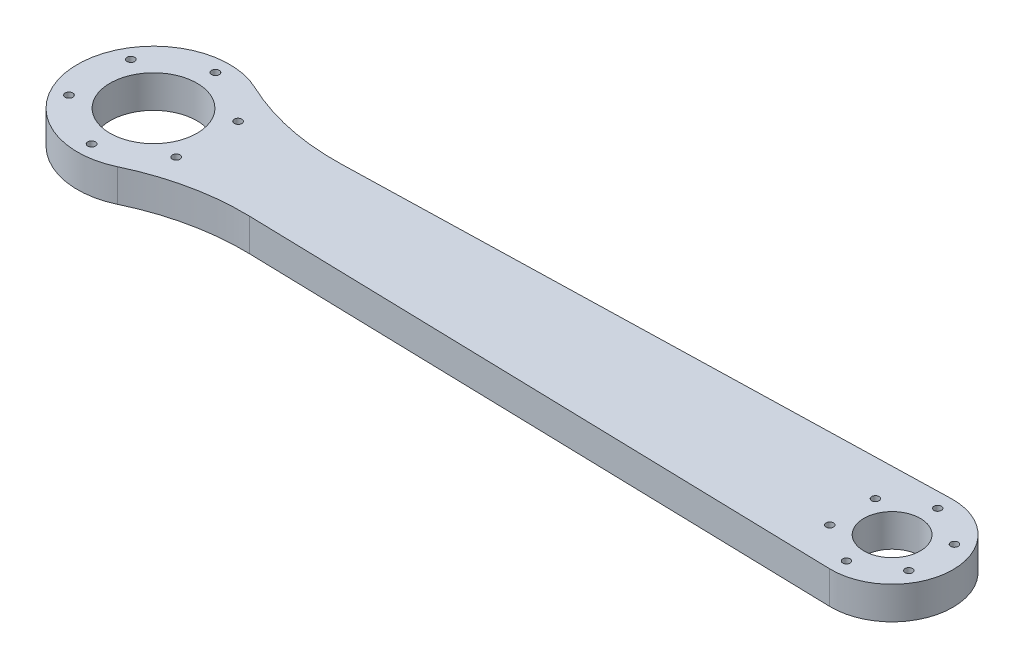
ISO-10303-21;
HEADER;
FILE_DESCRIPTION(('STEP AP214'),'2;1');
FILE_NAME('part.step','',(''),(''),'','','');
FILE_SCHEMA(('AUTOMOTIVE_DESIGN { 1 0 10303 214 1 1 1 1 }'));
ENDSEC;
DATA;
#1=APPLICATION_CONTEXT('core data for automotive mechanical design processes');
#2=APPLICATION_PROTOCOL_DEFINITION('international standard','automotive_design',2000,#1);
#3=PRODUCT_CONTEXT('',#1,'mechanical');
#4=PRODUCT('Part','Part','',(#3));
#5=PRODUCT_RELATED_PRODUCT_CATEGORY('part','',(#4));
#6=PRODUCT_DEFINITION_FORMATION('','',#4);
#7=PRODUCT_DEFINITION_CONTEXT('part definition',#1,'design');
#8=PRODUCT_DEFINITION('design','',#6,#7);
#9=PRODUCT_DEFINITION_SHAPE('','',#8);
#10=(LENGTH_UNIT() NAMED_UNIT(*) SI_UNIT(.MILLI.,.METRE.));
#11=(NAMED_UNIT(*) PLANE_ANGLE_UNIT() SI_UNIT($,.RADIAN.));
#12=(NAMED_UNIT(*) SI_UNIT($,.STERADIAN.) SOLID_ANGLE_UNIT());
#13=UNCERTAINTY_MEASURE_WITH_UNIT(LENGTH_MEASURE(1.E-05),#10,'distance_accuracy_value','');
#14=(GEOMETRIC_REPRESENTATION_CONTEXT(3) GLOBAL_UNCERTAINTY_ASSIGNED_CONTEXT((#13)) GLOBAL_UNIT_ASSIGNED_CONTEXT((#10,
#11,#12)) REPRESENTATION_CONTEXT('',''));
#15=CARTESIAN_POINT('',(0.,0.,0.));
#16=DIRECTION('',(0.,0.,1.));
#17=DIRECTION('',(1.,0.,0.));
#18=AXIS2_PLACEMENT_3D('',#15,#16,#17);
#19=CARTESIAN_POINT('',(340.,15.,0.));
#20=DIRECTION('',(0.,-1.,0.));
#21=DIRECTION('',(0.,0.,-1.));
#22=AXIS2_PLACEMENT_3D('',#19,#20,#21);
#23=PLANE('',#22);
#24=CARTESIAN_POINT('',(340.,15.,0.));
#25=DIRECTION('',(0.,1.,0.));
#26=DIRECTION('',(0.,0.,-1.));
#27=AXIS2_PLACEMENT_3D('',#24,#25,#26);
#28=CIRCLE('',#27,28.);
#29=CARTESIAN_POINT('',(339.279788909642,15.,27.9907358957446));
#30=VERTEX_POINT('',#29);
#31=CARTESIAN_POINT('',(339.279788909642,15.,-27.9907358957446));
#32=VERTEX_POINT('',#31);
#33=EDGE_CURVE('E131',#30,#32,#28,.T.);
#34=ORIENTED_EDGE('',*,*,#33,.T.);
#35=DIRECTION('',(-0.999669139133736,0.,0.0257218246556259));
#36=VECTOR('',#35,1.);
#37=CARTESIAN_POINT('',(65.1964156880508,15.,-20.9384781125971));
#38=LINE('',#37,#36);
#39=CARTESIAN_POINT('',(65.1964156880508,15.,-20.9384781125971));
#40=VERTEX_POINT('',#39);
#41=EDGE_CURVE('E89',#32,#40,#38,.T.);
#42=ORIENTED_EDGE('',*,*,#41,.T.);
#43=CARTESIAN_POINT('',(62.3670149759319,15.,-130.902083417308));
#44=DIRECTION('',(0.,-1.,0.));
#45=DIRECTION('',(0.,0.,1.));
#46=AXIS2_PLACEMENT_3D('',#43,#44,#45);
#47=CIRCLE('',#46,110.);
#48=CARTESIAN_POINT('',(15.0541070631559,15.,-31.5970546179709));
#49=VERTEX_POINT('',#48);
#50=EDGE_CURVE('E102',#40,#49,#47,.T.);
#51=ORIENTED_EDGE('',*,*,#50,.T.);
#52=CARTESIAN_POINT('',(0.,15.,2.42861286636753E-13));
#53=DIRECTION('',(0.,1.,0.));
#54=DIRECTION('',(0.,0.,1.));
#55=AXIS2_PLACEMENT_3D('',#52,#53,#54);
#56=CIRCLE('',#55,35.);
#57=CARTESIAN_POINT('',(15.0541070631561,15.,31.5970546179711));
#58=VERTEX_POINT('',#57);
#59=EDGE_CURVE('E96',#49,#58,#56,.T.);
#60=ORIENTED_EDGE('',*,*,#59,.T.);
#61=CARTESIAN_POINT('',(62.3670149759319,15.,130.902083417308));
#62=DIRECTION('',(0.,-1.,0.));
#63=DIRECTION('',(0.,0.,-1.));
#64=AXIS2_PLACEMENT_3D('',#61,#62,#63);
#65=CIRCLE('',#64,110.);
#66=CARTESIAN_POINT('',(65.1964156880508,15.,20.9384781125971));
#67=VERTEX_POINT('',#66);
#68=EDGE_CURVE('E100',#58,#67,#65,.T.);
#69=ORIENTED_EDGE('',*,*,#68,.T.);
#70=DIRECTION('',(0.999669139133736,0.,0.0257218246556259));
#71=VECTOR('',#70,1.);
#72=CARTESIAN_POINT('',(65.1964156880508,15.,20.9384781125971));
#73=LINE('',#72,#71);
#74=EDGE_CURVE('E52',#67,#30,#73,.T.);
#75=ORIENTED_EDGE('',*,*,#74,.T.);
#76=EDGE_LOOP('',(#34,#42,#51,#60,#69,#75));
#77=FACE_BOUND('',#76,.T.);
#78=CARTESIAN_POINT('',(0.,15.,0.));
#79=DIRECTION('',(0.,1.,0.));
#80=DIRECTION('',(0.,0.,1.));
#81=AXIS2_PLACEMENT_3D('',#78,#79,#80);
#82=CIRCLE('',#81,20.);
#83=CARTESIAN_POINT('',(0.,15.,20.));
#84=VERTEX_POINT('',#83);
#85=EDGE_CURVE('E124',#84,#84,#82,.T.);
#86=ORIENTED_EDGE('',*,*,#85,.F.);
#87=EDGE_LOOP('',(#86));
#88=FACE_BOUND('',#87,.T.);
#89=CARTESIAN_POINT('',(340.,15.,0.));
#90=DIRECTION('',(0.,1.,0.));
#91=DIRECTION('',(0.,0.,1.));
#92=AXIS2_PLACEMENT_3D('',#89,#90,#91);
#93=CIRCLE('',#92,13.);
#94=CARTESIAN_POINT('',(340.,15.,13.));
#95=VERTEX_POINT('',#94);
#96=EDGE_CURVE('E295',#95,#95,#93,.T.);
#97=ORIENTED_EDGE('',*,*,#96,.F.);
#98=EDGE_LOOP('',(#97));
#99=FACE_BOUND('',#98,.T.);
#100=CARTESIAN_POINT('',(358.186533479473,15.,-10.5));
#101=DIRECTION('',(0.,1.,0.));
#102=DIRECTION('',(0.,0.,1.));
#103=AXIS2_PLACEMENT_3D('',#100,#101,#102);
#104=CIRCLE('',#103,1.69999999999996);
#105=CARTESIAN_POINT('',(358.186533479473,15.,-8.80000000000005));
#106=VERTEX_POINT('',#105);
#107=EDGE_CURVE('E289',#106,#106,#104,.T.);
#108=ORIENTED_EDGE('',*,*,#107,.F.);
#109=EDGE_LOOP('',(#108));
#110=FACE_BOUND('',#109,.T.);
#111=CARTESIAN_POINT('',(340.,15.,-21.));
#112=DIRECTION('',(0.,1.,0.));
#113=DIRECTION('',(0.,0.,1.));
#114=AXIS2_PLACEMENT_3D('',#111,#112,#113);
#115=CIRCLE('',#114,1.69999999999996);
#116=CARTESIAN_POINT('',(340.,15.,-19.3));
#117=VERTEX_POINT('',#116);
#118=EDGE_CURVE('E283',#117,#117,#115,.T.);
#119=ORIENTED_EDGE('',*,*,#118,.F.);
#120=EDGE_LOOP('',(#119));
#121=FACE_BOUND('',#120,.T.);
#122=CARTESIAN_POINT('',(358.186533479473,15.,10.5));
#123=DIRECTION('',(0.,1.,0.));
#124=DIRECTION('',(0.,0.,1.));
#125=AXIS2_PLACEMENT_3D('',#122,#123,#124);
#126=CIRCLE('',#125,1.69999999999996);
#127=CARTESIAN_POINT('',(358.186533479473,15.,12.1999999999999));
#128=VERTEX_POINT('',#127);
#129=EDGE_CURVE('E277',#128,#128,#126,.T.);
#130=ORIENTED_EDGE('',*,*,#129,.F.);
#131=EDGE_LOOP('',(#130));
#132=FACE_BOUND('',#131,.T.);
#133=CARTESIAN_POINT('',(340.,15.,21.));
#134=DIRECTION('',(0.,1.,0.));
#135=DIRECTION('',(0.,0.,1.));
#136=AXIS2_PLACEMENT_3D('',#133,#134,#135);
#137=CIRCLE('',#136,1.69999999999996);
#138=CARTESIAN_POINT('',(340.,15.,22.6999999999999));
#139=VERTEX_POINT('',#138);
#140=EDGE_CURVE('E271',#139,#139,#137,.T.);
#141=ORIENTED_EDGE('',*,*,#140,.F.);
#142=EDGE_LOOP('',(#141));
#143=FACE_BOUND('',#142,.T.);
#144=CARTESIAN_POINT('',(321.813466520527,15.,10.5));
#145=DIRECTION('',(0.,1.,0.));
#146=DIRECTION('',(0.,0.,1.));
#147=AXIS2_PLACEMENT_3D('',#144,#145,#146);
#148=CIRCLE('',#147,1.69999999999996);
#149=CARTESIAN_POINT('',(321.813466520527,15.,12.2));
#150=VERTEX_POINT('',#149);
#151=EDGE_CURVE('E265',#150,#150,#148,.T.);
#152=ORIENTED_EDGE('',*,*,#151,.F.);
#153=EDGE_LOOP('',(#152));
#154=FACE_BOUND('',#153,.T.);
#155=CARTESIAN_POINT('',(321.813466520527,15.,-10.5));
#156=DIRECTION('',(0.,1.,0.));
#157=DIRECTION('',(0.,0.,1.));
#158=AXIS2_PLACEMENT_3D('',#155,#156,#157);
#159=CIRCLE('',#158,1.69999999999996);
#160=CARTESIAN_POINT('',(321.813466520527,15.,-8.80000000000005));
#161=VERTEX_POINT('',#160);
#162=EDGE_CURVE('E259',#161,#161,#159,.T.);
#163=ORIENTED_EDGE('',*,*,#162,.F.);
#164=EDGE_LOOP('',(#163));
#165=FACE_BOUND('',#164,.T.);
#166=CARTESIAN_POINT('',(-24.6817240078565,15.,-14.25));
#167=DIRECTION('',(0.,1.,0.));
#168=DIRECTION('',(0.,0.,1.));
#169=AXIS2_PLACEMENT_3D('',#166,#167,#168);
#170=CIRCLE('',#169,1.75);
#171=CARTESIAN_POINT('',(-24.6817240078565,15.,-12.5));
#172=VERTEX_POINT('',#171);
#173=EDGE_CURVE('E253',#172,#172,#170,.T.);
#174=ORIENTED_EDGE('',*,*,#173,.F.);
#175=EDGE_LOOP('',(#174));
#176=FACE_BOUND('',#175,.T.);
#177=CARTESIAN_POINT('',(0.,15.,-28.5));
#178=DIRECTION('',(0.,1.,0.));
#179=DIRECTION('',(0.,0.,1.));
#180=AXIS2_PLACEMENT_3D('',#177,#178,#179);
#181=CIRCLE('',#180,1.75);
#182=CARTESIAN_POINT('',(0.,15.,-26.75));
#183=VERTEX_POINT('',#182);
#184=EDGE_CURVE('E247',#183,#183,#181,.T.);
#185=ORIENTED_EDGE('',*,*,#184,.F.);
#186=EDGE_LOOP('',(#185));
#187=FACE_BOUND('',#186,.T.);
#188=CARTESIAN_POINT('',(-24.6817240078565,15.,14.25));
#189=DIRECTION('',(0.,1.,0.));
#190=DIRECTION('',(0.,0.,1.));
#191=AXIS2_PLACEMENT_3D('',#188,#189,#190);
#192=CIRCLE('',#191,1.75);
#193=CARTESIAN_POINT('',(-24.6817240078565,15.,16.));
#194=VERTEX_POINT('',#193);
#195=EDGE_CURVE('E241',#194,#194,#192,.T.);
#196=ORIENTED_EDGE('',*,*,#195,.F.);
#197=EDGE_LOOP('',(#196));
#198=FACE_BOUND('',#197,.T.);
#199=CARTESIAN_POINT('',(0.,15.,28.5));
#200=DIRECTION('',(0.,1.,0.));
#201=DIRECTION('',(0.,0.,1.));
#202=AXIS2_PLACEMENT_3D('',#199,#200,#201);
#203=CIRCLE('',#202,1.75);
#204=CARTESIAN_POINT('',(0.,15.,30.25));
#205=VERTEX_POINT('',#204);
#206=EDGE_CURVE('E235',#205,#205,#203,.T.);
#207=ORIENTED_EDGE('',*,*,#206,.F.);
#208=EDGE_LOOP('',(#207));
#209=FACE_BOUND('',#208,.T.);
#210=CARTESIAN_POINT('',(24.6817240078565,15.,14.25));
#211=DIRECTION('',(0.,1.,0.));
#212=DIRECTION('',(0.,0.,1.));
#213=AXIS2_PLACEMENT_3D('',#210,#211,#212);
#214=CIRCLE('',#213,1.75);
#215=CARTESIAN_POINT('',(24.6817240078565,15.,16.));
#216=VERTEX_POINT('',#215);
#217=EDGE_CURVE('E229',#216,#216,#214,.T.);
#218=ORIENTED_EDGE('',*,*,#217,.F.);
#219=EDGE_LOOP('',(#218));
#220=FACE_BOUND('',#219,.T.);
#221=CARTESIAN_POINT('',(24.6817240078565,15.,-14.25));
#222=DIRECTION('',(0.,1.,0.));
#223=DIRECTION('',(0.,0.,1.));
#224=AXIS2_PLACEMENT_3D('',#221,#222,#223);
#225=CIRCLE('',#224,1.75);
#226=CARTESIAN_POINT('',(24.6817240078565,15.,-12.5));
#227=VERTEX_POINT('',#226);
#228=EDGE_CURVE('E220',#227,#227,#225,.T.);
#229=ORIENTED_EDGE('',*,*,#228,.F.);
#230=EDGE_LOOP('',(#229));
#231=FACE_BOUND('',#230,.T.);
#232=ADVANCED_FACE('F35',(#77,#88,#99,#110,#121,#132,#143,#154,#165,#176,#187,#198,#209,#220,
#231),#23,.F.);
#233=CARTESIAN_POINT('',(340.,0.,0.));
#234=DIRECTION('',(0.,-1.,0.));
#235=DIRECTION('',(0.,0.,-1.));
#236=AXIS2_PLACEMENT_3D('',#233,#234,#235);
#237=PLANE('',#236);
#238=CARTESIAN_POINT('',(24.6817240078565,0.,14.25));
#239=DIRECTION('',(0.,1.,0.));
#240=DIRECTION('',(0.,0.,1.));
#241=AXIS2_PLACEMENT_3D('',#238,#239,#240);
#242=CIRCLE('',#241,1.75);
#243=CARTESIAN_POINT('',(24.6817240078565,0.,16.));
#244=VERTEX_POINT('',#243);
#245=EDGE_CURVE('E226',#244,#244,#242,.T.);
#246=ORIENTED_EDGE('',*,*,#245,.T.);
#247=EDGE_LOOP('',(#246));
#248=FACE_BOUND('',#247,.T.);
#249=CARTESIAN_POINT('',(-24.6817240078565,0.,14.25));
#250=DIRECTION('',(0.,1.,0.));
#251=DIRECTION('',(0.,0.,1.));
#252=AXIS2_PLACEMENT_3D('',#249,#250,#251);
#253=CIRCLE('',#252,1.75);
#254=CARTESIAN_POINT('',(-24.6817240078565,0.,16.));
#255=VERTEX_POINT('',#254);
#256=EDGE_CURVE('E238',#255,#255,#253,.T.);
#257=ORIENTED_EDGE('',*,*,#256,.T.);
#258=EDGE_LOOP('',(#257));
#259=FACE_BOUND('',#258,.T.);
#260=CARTESIAN_POINT('',(-24.6817240078565,0.,-14.25));
#261=DIRECTION('',(0.,1.,0.));
#262=DIRECTION('',(0.,0.,1.));
#263=AXIS2_PLACEMENT_3D('',#260,#261,#262);
#264=CIRCLE('',#263,1.75);
#265=CARTESIAN_POINT('',(-24.6817240078565,0.,-12.5));
#266=VERTEX_POINT('',#265);
#267=EDGE_CURVE('E250',#266,#266,#264,.T.);
#268=ORIENTED_EDGE('',*,*,#267,.T.);
#269=EDGE_LOOP('',(#268));
#270=FACE_BOUND('',#269,.T.);
#271=CARTESIAN_POINT('',(321.813466520527,0.,10.5));
#272=DIRECTION('',(0.,1.,0.));
#273=DIRECTION('',(0.,0.,1.));
#274=AXIS2_PLACEMENT_3D('',#271,#272,#273);
#275=CIRCLE('',#274,1.69999999999996);
#276=CARTESIAN_POINT('',(321.813466520527,0.,12.2));
#277=VERTEX_POINT('',#276);
#278=EDGE_CURVE('E262',#277,#277,#275,.T.);
#279=ORIENTED_EDGE('',*,*,#278,.T.);
#280=EDGE_LOOP('',(#279));
#281=FACE_BOUND('',#280,.T.);
#282=CARTESIAN_POINT('',(358.186533479473,0.,10.5));
#283=DIRECTION('',(0.,1.,0.));
#284=DIRECTION('',(0.,0.,1.));
#285=AXIS2_PLACEMENT_3D('',#282,#283,#284);
#286=CIRCLE('',#285,1.69999999999996);
#287=CARTESIAN_POINT('',(358.186533479473,0.,12.1999999999999));
#288=VERTEX_POINT('',#287);
#289=EDGE_CURVE('E274',#288,#288,#286,.T.);
#290=ORIENTED_EDGE('',*,*,#289,.T.);
#291=EDGE_LOOP('',(#290));
#292=FACE_BOUND('',#291,.T.);
#293=CARTESIAN_POINT('',(358.186533479473,0.,-10.5));
#294=DIRECTION('',(0.,1.,0.));
#295=DIRECTION('',(0.,0.,1.));
#296=AXIS2_PLACEMENT_3D('',#293,#294,#295);
#297=CIRCLE('',#296,1.69999999999996);
#298=CARTESIAN_POINT('',(358.186533479473,0.,-8.80000000000005));
#299=VERTEX_POINT('',#298);
#300=EDGE_CURVE('E286',#299,#299,#297,.T.);
#301=ORIENTED_EDGE('',*,*,#300,.T.);
#302=EDGE_LOOP('',(#301));
#303=FACE_BOUND('',#302,.T.);
#304=CARTESIAN_POINT('',(0.,0.,0.));
#305=DIRECTION('',(0.,1.,0.));
#306=DIRECTION('',(0.,0.,1.));
#307=AXIS2_PLACEMENT_3D('',#304,#305,#306);
#308=CIRCLE('',#307,20.);
#309=CARTESIAN_POINT('',(0.,0.,20.));
#310=VERTEX_POINT('',#309);
#311=EDGE_CURVE('E298',#310,#310,#308,.T.);
#312=ORIENTED_EDGE('',*,*,#311,.T.);
#313=EDGE_LOOP('',(#312));
#314=FACE_BOUND('',#313,.T.);
#315=CARTESIAN_POINT('',(340.,0.,0.));
#316=DIRECTION('',(0.,1.,0.));
#317=DIRECTION('',(0.,0.,-1.));
#318=AXIS2_PLACEMENT_3D('',#315,#316,#317);
#319=CIRCLE('',#318,28.);
#320=CARTESIAN_POINT('',(339.279788909642,0.,27.9907358957446));
#321=VERTEX_POINT('',#320);
#322=CARTESIAN_POINT('',(339.279788909642,0.,-27.9907358957446));
#323=VERTEX_POINT('',#322);
#324=EDGE_CURVE('E120',#321,#323,#319,.T.);
#325=ORIENTED_EDGE('',*,*,#324,.F.);
#326=DIRECTION('',(0.999669139133736,0.,0.0257218246556259));
#327=VECTOR('',#326,1.);
#328=CARTESIAN_POINT('',(65.1964156880508,0.,20.9384781125971));
#329=LINE('',#328,#327);
#330=CARTESIAN_POINT('',(65.1964156880508,0.,20.9384781125971));
#331=VERTEX_POINT('',#330);
#332=EDGE_CURVE('E81',#331,#321,#329,.T.);
#333=ORIENTED_EDGE('',*,*,#332,.F.);
#334=CARTESIAN_POINT('',(62.3670149759319,0.,130.902083417308));
#335=DIRECTION('',(0.,-1.,0.));
#336=DIRECTION('',(0.,0.,-1.));
#337=AXIS2_PLACEMENT_3D('',#334,#335,#336);
#338=CIRCLE('',#337,110.);
#339=CARTESIAN_POINT('',(15.0541070631561,0.,31.5970546179711));
#340=VERTEX_POINT('',#339);
#341=EDGE_CURVE('E75',#340,#331,#338,.T.);
#342=ORIENTED_EDGE('',*,*,#341,.F.);
#343=CARTESIAN_POINT('',(0.,0.,2.42861286636753E-13));
#344=DIRECTION('',(0.,1.,0.));
#345=DIRECTION('',(0.,0.,1.));
#346=AXIS2_PLACEMENT_3D('',#343,#344,#345);
#347=CIRCLE('',#346,35.);
#348=CARTESIAN_POINT('',(15.0541070631559,0.,-31.5970546179709));
#349=VERTEX_POINT('',#348);
#350=EDGE_CURVE('E110',#349,#340,#347,.T.);
#351=ORIENTED_EDGE('',*,*,#350,.F.);
#352=CARTESIAN_POINT('',(62.3670149759319,0.,-130.902083417308));
#353=DIRECTION('',(0.,-1.,0.));
#354=DIRECTION('',(0.,0.,1.));
#355=AXIS2_PLACEMENT_3D('',#352,#353,#354);
#356=CIRCLE('',#355,110.);
#357=CARTESIAN_POINT('',(65.1964156880508,0.,-20.9384781125971));
#358=VERTEX_POINT('',#357);
#359=EDGE_CURVE('E126',#358,#349,#356,.T.);
#360=ORIENTED_EDGE('',*,*,#359,.F.);
#361=DIRECTION('',(-0.999669139133736,0.,0.0257218246556259));
#362=VECTOR('',#361,1.);
#363=CARTESIAN_POINT('',(65.1964156880508,0.,-20.9384781125971));
#364=LINE('',#363,#362);
#365=EDGE_CURVE('E123',#323,#358,#364,.T.);
#366=ORIENTED_EDGE('',*,*,#365,.F.);
#367=EDGE_LOOP('',(#325,#333,#342,#351,#360,#366));
#368=FACE_BOUND('',#367,.T.);
#369=CARTESIAN_POINT('',(340.,0.,0.));
#370=DIRECTION('',(0.,1.,0.));
#371=DIRECTION('',(0.,0.,1.));
#372=AXIS2_PLACEMENT_3D('',#369,#370,#371);
#373=CIRCLE('',#372,13.);
#374=CARTESIAN_POINT('',(340.,0.,13.));
#375=VERTEX_POINT('',#374);
#376=EDGE_CURVE('E292',#375,#375,#373,.T.);
#377=ORIENTED_EDGE('',*,*,#376,.T.);
#378=EDGE_LOOP('',(#377));
#379=FACE_BOUND('',#378,.T.);
#380=CARTESIAN_POINT('',(340.,0.,-21.));
#381=DIRECTION('',(0.,1.,0.));
#382=DIRECTION('',(0.,0.,1.));
#383=AXIS2_PLACEMENT_3D('',#380,#381,#382);
#384=CIRCLE('',#383,1.69999999999996);
#385=CARTESIAN_POINT('',(340.,0.,-19.3));
#386=VERTEX_POINT('',#385);
#387=EDGE_CURVE('E280',#386,#386,#384,.T.);
#388=ORIENTED_EDGE('',*,*,#387,.T.);
#389=EDGE_LOOP('',(#388));
#390=FACE_BOUND('',#389,.T.);
#391=CARTESIAN_POINT('',(340.,0.,21.));
#392=DIRECTION('',(0.,1.,0.));
#393=DIRECTION('',(0.,0.,1.));
#394=AXIS2_PLACEMENT_3D('',#391,#392,#393);
#395=CIRCLE('',#394,1.69999999999996);
#396=CARTESIAN_POINT('',(340.,0.,22.6999999999999));
#397=VERTEX_POINT('',#396);
#398=EDGE_CURVE('E268',#397,#397,#395,.T.);
#399=ORIENTED_EDGE('',*,*,#398,.T.);
#400=EDGE_LOOP('',(#399));
#401=FACE_BOUND('',#400,.T.);
#402=CARTESIAN_POINT('',(321.813466520527,0.,-10.5));
#403=DIRECTION('',(0.,1.,0.));
#404=DIRECTION('',(0.,0.,1.));
#405=AXIS2_PLACEMENT_3D('',#402,#403,#404);
#406=CIRCLE('',#405,1.69999999999996);
#407=CARTESIAN_POINT('',(321.813466520527,0.,-8.80000000000005));
#408=VERTEX_POINT('',#407);
#409=EDGE_CURVE('E256',#408,#408,#406,.T.);
#410=ORIENTED_EDGE('',*,*,#409,.T.);
#411=EDGE_LOOP('',(#410));
#412=FACE_BOUND('',#411,.T.);
#413=CARTESIAN_POINT('',(0.,0.,-28.5));
#414=DIRECTION('',(0.,1.,0.));
#415=DIRECTION('',(0.,0.,1.));
#416=AXIS2_PLACEMENT_3D('',#413,#414,#415);
#417=CIRCLE('',#416,1.75);
#418=CARTESIAN_POINT('',(0.,0.,-26.75));
#419=VERTEX_POINT('',#418);
#420=EDGE_CURVE('E244',#419,#419,#417,.T.);
#421=ORIENTED_EDGE('',*,*,#420,.T.);
#422=EDGE_LOOP('',(#421));
#423=FACE_BOUND('',#422,.T.);
#424=CARTESIAN_POINT('',(0.,0.,28.5));
#425=DIRECTION('',(0.,1.,0.));
#426=DIRECTION('',(0.,0.,1.));
#427=AXIS2_PLACEMENT_3D('',#424,#425,#426);
#428=CIRCLE('',#427,1.75);
#429=CARTESIAN_POINT('',(0.,0.,30.25));
#430=VERTEX_POINT('',#429);
#431=EDGE_CURVE('E232',#430,#430,#428,.T.);
#432=ORIENTED_EDGE('',*,*,#431,.T.);
#433=EDGE_LOOP('',(#432));
#434=FACE_BOUND('',#433,.T.);
#435=CARTESIAN_POINT('',(24.6817240078565,0.,-14.25));
#436=DIRECTION('',(0.,1.,0.));
#437=DIRECTION('',(0.,0.,1.));
#438=AXIS2_PLACEMENT_3D('',#435,#436,#437);
#439=CIRCLE('',#438,1.75);
#440=CARTESIAN_POINT('',(24.6817240078565,0.,-12.5));
#441=VERTEX_POINT('',#440);
#442=EDGE_CURVE('E223',#441,#441,#439,.T.);
#443=ORIENTED_EDGE('',*,*,#442,.T.);
#444=EDGE_LOOP('',(#443));
#445=FACE_BOUND('',#444,.T.);
#446=ADVANCED_FACE('F140',(#248,#259,#270,#281,#292,#303,#314,#368,#379,#390,#401,#412,#423,
#434,#445),#237,.T.);
#447=CARTESIAN_POINT('',(340.,15.,0.));
#448=DIRECTION('',(0.,-1.,0.));
#449=DIRECTION('',(0.,0.,-1.));
#450=AXIS2_PLACEMENT_3D('',#447,#448,#449);
#451=CYLINDRICAL_SURFACE('',#450,28.);
#452=ORIENTED_EDGE('',*,*,#324,.T.);
#453=DIRECTION('',(0.,-1.,0.));
#454=VECTOR('',#453,1.);
#455=CARTESIAN_POINT('',(339.279788909642,15.,-27.9907358957446));
#456=LINE('',#455,#454);
#457=EDGE_CURVE('E11',#32,#323,#456,.T.);
#458=ORIENTED_EDGE('',*,*,#457,.F.);
#459=ORIENTED_EDGE('',*,*,#33,.F.);
#460=DIRECTION('',(0.,-1.,0.));
#461=VECTOR('',#460,1.);
#462=CARTESIAN_POINT('',(339.279788909642,15.,27.9907358957446));
#463=LINE('',#462,#461);
#464=EDGE_CURVE('E116',#30,#321,#463,.T.);
#465=ORIENTED_EDGE('',*,*,#464,.T.);
#466=EDGE_LOOP('',(#452,#458,#459,#465));
#467=FACE_BOUND('',#466,.T.);
#468=ADVANCED_FACE('F37',(#467),#451,.T.);
#469=CARTESIAN_POINT('',(65.1964156880508,15.,-20.9384781125971));
#470=DIRECTION('',(0.0257218246556259,0.,0.999669139133736));
#471=DIRECTION('',(0.999669139133736,0.,-0.0257218246556259));
#472=AXIS2_PLACEMENT_3D('',#469,#470,#471);
#473=PLANE('',#472);
#474=ORIENTED_EDGE('',*,*,#365,.T.);
#475=DIRECTION('',(0.,-1.,0.));
#476=VECTOR('',#475,1.);
#477=CARTESIAN_POINT('',(65.1964156880508,15.,-20.9384781125971));
#478=LINE('',#477,#476);
#479=EDGE_CURVE('E44',#40,#358,#478,.T.);
#480=ORIENTED_EDGE('',*,*,#479,.F.);
#481=ORIENTED_EDGE('',*,*,#41,.F.);
#482=ORIENTED_EDGE('',*,*,#457,.T.);
#483=EDGE_LOOP('',(#474,#480,#481,#482));
#484=FACE_BOUND('',#483,.T.);
#485=ADVANCED_FACE('F448',(#484),#473,.F.);
#486=CARTESIAN_POINT('',(62.3670149759319,15.,-130.902083417308));
#487=DIRECTION('',(0.,-1.,0.));
#488=DIRECTION('',(0.,0.,-1.));
#489=AXIS2_PLACEMENT_3D('',#486,#487,#488);
#490=CYLINDRICAL_SURFACE('',#489,110.);
#491=ORIENTED_EDGE('',*,*,#359,.T.);
#492=DIRECTION('',(0.,-1.,0.));
#493=VECTOR('',#492,1.);
#494=CARTESIAN_POINT('',(15.0541070631559,15.,-31.5970546179709));
#495=LINE('',#494,#493);
#496=EDGE_CURVE('E111',#49,#349,#495,.T.);
#497=ORIENTED_EDGE('',*,*,#496,.F.);
#498=ORIENTED_EDGE('',*,*,#50,.F.);
#499=ORIENTED_EDGE('',*,*,#479,.T.);
#500=EDGE_LOOP('',(#491,#497,#498,#499));
#501=FACE_BOUND('',#500,.T.);
#502=ADVANCED_FACE('F137',(#501),#490,.F.);
#503=CARTESIAN_POINT('',(0.,15.,2.42861286636753E-13));
#504=DIRECTION('',(0.,-1.,0.));
#505=DIRECTION('',(0.,0.,-1.));
#506=AXIS2_PLACEMENT_3D('',#503,#504,#505);
#507=CYLINDRICAL_SURFACE('',#506,35.);
#508=ORIENTED_EDGE('',*,*,#350,.T.);
#509=DIRECTION('',(0.,-1.,0.));
#510=VECTOR('',#509,1.);
#511=CARTESIAN_POINT('',(15.0541070631561,15.,31.5970546179711));
#512=LINE('',#511,#510);
#513=EDGE_CURVE('E107',#58,#340,#512,.T.);
#514=ORIENTED_EDGE('',*,*,#513,.F.);
#515=ORIENTED_EDGE('',*,*,#59,.F.);
#516=ORIENTED_EDGE('',*,*,#496,.T.);
#517=EDGE_LOOP('',(#508,#514,#515,#516));
#518=FACE_BOUND('',#517,.T.);
#519=ADVANCED_FACE('F108',(#518),#507,.T.);
#520=CARTESIAN_POINT('',(62.3670149759319,15.,130.902083417308));
#521=DIRECTION('',(0.,-1.,0.));
#522=DIRECTION('',(0.,0.,-1.));
#523=AXIS2_PLACEMENT_3D('',#520,#521,#522);
#524=CYLINDRICAL_SURFACE('',#523,110.);
#525=ORIENTED_EDGE('',*,*,#341,.T.);
#526=DIRECTION('',(0.,-1.,0.));
#527=VECTOR('',#526,1.);
#528=CARTESIAN_POINT('',(65.1964156880508,15.,20.9384781125971));
#529=LINE('',#528,#527);
#530=EDGE_CURVE('E112',#67,#331,#529,.T.);
#531=ORIENTED_EDGE('',*,*,#530,.F.);
#532=ORIENTED_EDGE('',*,*,#68,.F.);
#533=ORIENTED_EDGE('',*,*,#513,.T.);
#534=EDGE_LOOP('',(#525,#531,#532,#533));
#535=FACE_BOUND('',#534,.T.);
#536=ADVANCED_FACE('F114',(#535),#524,.F.);
#537=CARTESIAN_POINT('',(65.1964156880508,15.,20.9384781125971));
#538=DIRECTION('',(0.0257218246556259,0.,-0.999669139133736));
#539=DIRECTION('',(-0.999669139133736,0.,-0.0257218246556259));
#540=AXIS2_PLACEMENT_3D('',#537,#538,#539);
#541=PLANE('',#540);
#542=ORIENTED_EDGE('',*,*,#332,.T.);
#543=ORIENTED_EDGE('',*,*,#464,.F.);
#544=ORIENTED_EDGE('',*,*,#74,.F.);
#545=ORIENTED_EDGE('',*,*,#530,.T.);
#546=EDGE_LOOP('',(#542,#543,#544,#545));
#547=FACE_BOUND('',#546,.T.);
#548=ADVANCED_FACE('F145',(#547),#541,.F.);
#549=CARTESIAN_POINT('',(0.,15.,0.));
#550=DIRECTION('',(0.,-1.,0.));
#551=DIRECTION('',(0.,0.,-1.));
#552=AXIS2_PLACEMENT_3D('',#549,#550,#551);
#553=CYLINDRICAL_SURFACE('',#552,20.);
#554=ORIENTED_EDGE('',*,*,#85,.T.);
#555=EDGE_LOOP('',(#554));
#556=FACE_BOUND('',#555,.T.);
#557=ORIENTED_EDGE('',*,*,#311,.F.);
#558=EDGE_LOOP('',(#557));
#559=FACE_BOUND('',#558,.T.);
#560=ADVANCED_FACE('F147',(#556,#559),#553,.F.);
#561=CARTESIAN_POINT('',(340.,15.,0.));
#562=DIRECTION('',(0.,-1.,0.));
#563=DIRECTION('',(0.,0.,-1.));
#564=AXIS2_PLACEMENT_3D('',#561,#562,#563);
#565=CYLINDRICAL_SURFACE('',#564,13.);
#566=ORIENTED_EDGE('',*,*,#96,.T.);
#567=EDGE_LOOP('',(#566));
#568=FACE_BOUND('',#567,.T.);
#569=ORIENTED_EDGE('',*,*,#376,.F.);
#570=EDGE_LOOP('',(#569));
#571=FACE_BOUND('',#570,.T.);
#572=ADVANCED_FACE('F153',(#568,#571),#565,.F.);
#573=CARTESIAN_POINT('',(358.186533479473,15.,-10.5));
#574=DIRECTION('',(0.,-1.,0.));
#575=DIRECTION('',(0.,0.,-1.));
#576=AXIS2_PLACEMENT_3D('',#573,#574,#575);
#577=CYLINDRICAL_SURFACE('',#576,1.69999999999996);
#578=ORIENTED_EDGE('',*,*,#107,.T.);
#579=EDGE_LOOP('',(#578));
#580=FACE_BOUND('',#579,.T.);
#581=ORIENTED_EDGE('',*,*,#300,.F.);
#582=EDGE_LOOP('',(#581));
#583=FACE_BOUND('',#582,.T.);
#584=ADVANCED_FACE('F167',(#580,#583),#577,.F.);
#585=CARTESIAN_POINT('',(340.,15.,-21.));
#586=DIRECTION('',(0.,-1.,0.));
#587=DIRECTION('',(0.,0.,-1.));
#588=AXIS2_PLACEMENT_3D('',#585,#586,#587);
#589=CYLINDRICAL_SURFACE('',#588,1.69999999999996);
#590=ORIENTED_EDGE('',*,*,#118,.T.);
#591=EDGE_LOOP('',(#590));
#592=FACE_BOUND('',#591,.T.);
#593=ORIENTED_EDGE('',*,*,#387,.F.);
#594=EDGE_LOOP('',(#593));
#595=FACE_BOUND('',#594,.T.);
#596=ADVANCED_FACE('F171',(#592,#595),#589,.F.);
#597=CARTESIAN_POINT('',(358.186533479473,15.,10.5));
#598=DIRECTION('',(0.,-1.,0.));
#599=DIRECTION('',(0.,0.,-1.));
#600=AXIS2_PLACEMENT_3D('',#597,#598,#599);
#601=CYLINDRICAL_SURFACE('',#600,1.69999999999996);
#602=ORIENTED_EDGE('',*,*,#129,.T.);
#603=EDGE_LOOP('',(#602));
#604=FACE_BOUND('',#603,.T.);
#605=ORIENTED_EDGE('',*,*,#289,.F.);
#606=EDGE_LOOP('',(#605));
#607=FACE_BOUND('',#606,.T.);
#608=ADVANCED_FACE('F175',(#604,#607),#601,.F.);
#609=CARTESIAN_POINT('',(340.,15.,21.));
#610=DIRECTION('',(0.,-1.,0.));
#611=DIRECTION('',(0.,0.,-1.));
#612=AXIS2_PLACEMENT_3D('',#609,#610,#611);
#613=CYLINDRICAL_SURFACE('',#612,1.69999999999996);
#614=ORIENTED_EDGE('',*,*,#140,.T.);
#615=EDGE_LOOP('',(#614));
#616=FACE_BOUND('',#615,.T.);
#617=ORIENTED_EDGE('',*,*,#398,.F.);
#618=EDGE_LOOP('',(#617));
#619=FACE_BOUND('',#618,.T.);
#620=ADVANCED_FACE('F179',(#616,#619),#613,.F.);
#621=CARTESIAN_POINT('',(321.813466520527,15.,10.5));
#622=DIRECTION('',(0.,-1.,0.));
#623=DIRECTION('',(0.,0.,-1.));
#624=AXIS2_PLACEMENT_3D('',#621,#622,#623);
#625=CYLINDRICAL_SURFACE('',#624,1.69999999999996);
#626=ORIENTED_EDGE('',*,*,#151,.T.);
#627=EDGE_LOOP('',(#626));
#628=FACE_BOUND('',#627,.T.);
#629=ORIENTED_EDGE('',*,*,#278,.F.);
#630=EDGE_LOOP('',(#629));
#631=FACE_BOUND('',#630,.T.);
#632=ADVANCED_FACE('F183',(#628,#631),#625,.F.);
#633=CARTESIAN_POINT('',(321.813466520527,15.,-10.5));
#634=DIRECTION('',(0.,-1.,0.));
#635=DIRECTION('',(0.,0.,-1.));
#636=AXIS2_PLACEMENT_3D('',#633,#634,#635);
#637=CYLINDRICAL_SURFACE('',#636,1.69999999999996);
#638=ORIENTED_EDGE('',*,*,#162,.T.);
#639=EDGE_LOOP('',(#638));
#640=FACE_BOUND('',#639,.T.);
#641=ORIENTED_EDGE('',*,*,#409,.F.);
#642=EDGE_LOOP('',(#641));
#643=FACE_BOUND('',#642,.T.);
#644=ADVANCED_FACE('F187',(#640,#643),#637,.F.);
#645=CARTESIAN_POINT('',(-24.6817240078565,15.,-14.25));
#646=DIRECTION('',(0.,-1.,0.));
#647=DIRECTION('',(0.,0.,-1.));
#648=AXIS2_PLACEMENT_3D('',#645,#646,#647);
#649=CYLINDRICAL_SURFACE('',#648,1.75);
#650=ORIENTED_EDGE('',*,*,#173,.T.);
#651=EDGE_LOOP('',(#650));
#652=FACE_BOUND('',#651,.T.);
#653=ORIENTED_EDGE('',*,*,#267,.F.);
#654=EDGE_LOOP('',(#653));
#655=FACE_BOUND('',#654,.T.);
#656=ADVANCED_FACE('F191',(#652,#655),#649,.F.);
#657=CARTESIAN_POINT('',(0.,15.,-28.5));
#658=DIRECTION('',(0.,-1.,0.));
#659=DIRECTION('',(0.,0.,-1.));
#660=AXIS2_PLACEMENT_3D('',#657,#658,#659);
#661=CYLINDRICAL_SURFACE('',#660,1.75);
#662=ORIENTED_EDGE('',*,*,#184,.T.);
#663=EDGE_LOOP('',(#662));
#664=FACE_BOUND('',#663,.T.);
#665=ORIENTED_EDGE('',*,*,#420,.F.);
#666=EDGE_LOOP('',(#665));
#667=FACE_BOUND('',#666,.T.);
#668=ADVANCED_FACE('F195',(#664,#667),#661,.F.);
#669=CARTESIAN_POINT('',(-24.6817240078565,15.,14.25));
#670=DIRECTION('',(0.,-1.,0.));
#671=DIRECTION('',(0.,0.,-1.));
#672=AXIS2_PLACEMENT_3D('',#669,#670,#671);
#673=CYLINDRICAL_SURFACE('',#672,1.75);
#674=ORIENTED_EDGE('',*,*,#195,.T.);
#675=EDGE_LOOP('',(#674));
#676=FACE_BOUND('',#675,.T.);
#677=ORIENTED_EDGE('',*,*,#256,.F.);
#678=EDGE_LOOP('',(#677));
#679=FACE_BOUND('',#678,.T.);
#680=ADVANCED_FACE('F199',(#676,#679),#673,.F.);
#681=CARTESIAN_POINT('',(0.,15.,28.5));
#682=DIRECTION('',(0.,-1.,0.));
#683=DIRECTION('',(0.,0.,-1.));
#684=AXIS2_PLACEMENT_3D('',#681,#682,#683);
#685=CYLINDRICAL_SURFACE('',#684,1.75);
#686=ORIENTED_EDGE('',*,*,#206,.T.);
#687=EDGE_LOOP('',(#686));
#688=FACE_BOUND('',#687,.T.);
#689=ORIENTED_EDGE('',*,*,#431,.F.);
#690=EDGE_LOOP('',(#689));
#691=FACE_BOUND('',#690,.T.);
#692=ADVANCED_FACE('F203',(#688,#691),#685,.F.);
#693=CARTESIAN_POINT('',(24.6817240078565,15.,14.25));
#694=DIRECTION('',(0.,-1.,0.));
#695=DIRECTION('',(0.,0.,-1.));
#696=AXIS2_PLACEMENT_3D('',#693,#694,#695);
#697=CYLINDRICAL_SURFACE('',#696,1.75);
#698=ORIENTED_EDGE('',*,*,#217,.T.);
#699=EDGE_LOOP('',(#698));
#700=FACE_BOUND('',#699,.T.);
#701=ORIENTED_EDGE('',*,*,#245,.F.);
#702=EDGE_LOOP('',(#701));
#703=FACE_BOUND('',#702,.T.);
#704=ADVANCED_FACE('F207',(#700,#703),#697,.F.);
#705=CARTESIAN_POINT('',(24.6817240078565,15.,-14.25));
#706=DIRECTION('',(0.,-1.,0.));
#707=DIRECTION('',(0.,0.,-1.));
#708=AXIS2_PLACEMENT_3D('',#705,#706,#707);
#709=CYLINDRICAL_SURFACE('',#708,1.75);
#710=ORIENTED_EDGE('',*,*,#228,.T.);
#711=EDGE_LOOP('',(#710));
#712=FACE_BOUND('',#711,.T.);
#713=ORIENTED_EDGE('',*,*,#442,.F.);
#714=EDGE_LOOP('',(#713));
#715=FACE_BOUND('',#714,.T.);
#716=ADVANCED_FACE('F211',(#712,#715),#709,.F.);
#717=CLOSED_SHELL('',(#232,#446,#468,#485,#502,#519,#536,#548,#560,#572,#584,#596,#608,#620,
#632,#644,#656,#668,#680,#692,#704,#716));
#718=MANIFOLD_SOLID_BREP('B2',#717);
#719=ADVANCED_BREP_SHAPE_REPRESENTATION('',(#18,#718),#14);
#720=SHAPE_DEFINITION_REPRESENTATION(#9,#719);
ENDSEC;
END-ISO-10303-21;
